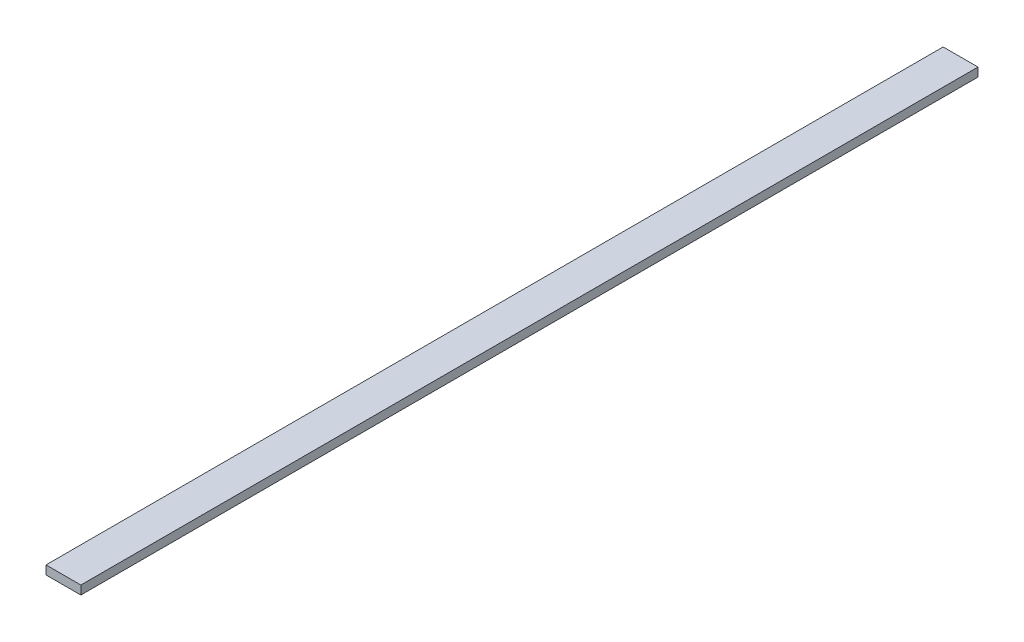
ISO-10303-21;
HEADER;
FILE_DESCRIPTION(('STEP AP214'),'2;1');
FILE_NAME('part.step','',(''),(''),'','','');
FILE_SCHEMA(('AUTOMOTIVE_DESIGN { 1 0 10303 214 1 1 1 1 }'));
ENDSEC;
DATA;
#1=APPLICATION_CONTEXT('core data for automotive mechanical design processes');
#2=APPLICATION_PROTOCOL_DEFINITION('international standard','automotive_design',2000,#1);
#3=PRODUCT_CONTEXT('',#1,'mechanical');
#4=PRODUCT('Part','Part','',(#3));
#5=PRODUCT_RELATED_PRODUCT_CATEGORY('part','',(#4));
#6=PRODUCT_DEFINITION_FORMATION('','',#4);
#7=PRODUCT_DEFINITION_CONTEXT('part definition',#1,'design');
#8=PRODUCT_DEFINITION('design','',#6,#7);
#9=PRODUCT_DEFINITION_SHAPE('','',#8);
#10=(LENGTH_UNIT() NAMED_UNIT(*) SI_UNIT(.MILLI.,.METRE.));
#11=(NAMED_UNIT(*) PLANE_ANGLE_UNIT() SI_UNIT($,.RADIAN.));
#12=(NAMED_UNIT(*) SI_UNIT($,.STERADIAN.) SOLID_ANGLE_UNIT());
#13=UNCERTAINTY_MEASURE_WITH_UNIT(LENGTH_MEASURE(1.E-05),#10,'distance_accuracy_value','');
#14=(GEOMETRIC_REPRESENTATION_CONTEXT(3) GLOBAL_UNCERTAINTY_ASSIGNED_CONTEXT((#13)) GLOBAL_UNIT_ASSIGNED_CONTEXT((#10,
#11,#12)) REPRESENTATION_CONTEXT('',''));
#15=CARTESIAN_POINT('',(0.,0.,0.));
#16=DIRECTION('',(0.,0.,1.));
#17=DIRECTION('',(1.,0.,0.));
#18=AXIS2_PLACEMENT_3D('',#15,#16,#17);
#19=CARTESIAN_POINT('',(0.,0.,-5150.));
#20=DIRECTION('',(1.,0.,0.));
#21=DIRECTION('',(0.,0.,-1.));
#22=AXIS2_PLACEMENT_3D('',#19,#20,#21);
#23=PLANE('',#22);
#24=DIRECTION('',(0.,1.,0.));
#25=VECTOR('',#24,1.);
#26=CARTESIAN_POINT('',(0.,0.,0.));
#27=LINE('',#26,#25);
#28=CARTESIAN_POINT('',(0.,0.,0.));
#29=VERTEX_POINT('',#28);
#30=CARTESIAN_POINT('',(0.,50.,0.));
#31=VERTEX_POINT('',#30);
#32=EDGE_CURVE('E100',#29,#31,#27,.T.);
#33=ORIENTED_EDGE('',*,*,#32,.F.);
#34=DIRECTION('',(0.,0.,1.));
#35=VECTOR('',#34,1.);
#36=CARTESIAN_POINT('',(0.,0.,-5150.));
#37=LINE('',#36,#35);
#38=CARTESIAN_POINT('',(0.,0.,-5150.));
#39=VERTEX_POINT('',#38);
#40=EDGE_CURVE('E11',#39,#29,#37,.T.);
#41=ORIENTED_EDGE('',*,*,#40,.F.);
#42=DIRECTION('',(0.,1.,0.));
#43=VECTOR('',#42,1.);
#44=CARTESIAN_POINT('',(0.,0.,-5150.));
#45=LINE('',#44,#43);
#46=CARTESIAN_POINT('',(0.,50.,-5150.));
#47=VERTEX_POINT('',#46);
#48=EDGE_CURVE('E94',#39,#47,#45,.T.);
#49=ORIENTED_EDGE('',*,*,#48,.T.);
#50=DIRECTION('',(0.,0.,1.));
#51=VECTOR('',#50,1.);
#52=CARTESIAN_POINT('',(0.,50.,-5150.));
#53=LINE('',#52,#51);
#54=EDGE_CURVE('E39',#47,#31,#53,.T.);
#55=ORIENTED_EDGE('',*,*,#54,.T.);
#56=EDGE_LOOP('',(#33,#41,#49,#55));
#57=FACE_BOUND('',#56,.T.);
#58=ADVANCED_FACE('F36',(#57),#23,.T.);
#59=CARTESIAN_POINT('',(0.,0.,-5150.));
#60=DIRECTION('',(0.,-1.,0.));
#61=DIRECTION('',(0.,0.,-1.));
#62=AXIS2_PLACEMENT_3D('',#59,#60,#61);
#63=PLANE('',#62);
#64=DIRECTION('',(1.,0.,0.));
#65=VECTOR('',#64,1.);
#66=CARTESIAN_POINT('',(0.,0.,0.));
#67=LINE('',#66,#65);
#68=CARTESIAN_POINT('',(-200.,0.,0.));
#69=VERTEX_POINT('',#68);
#70=EDGE_CURVE('E96',#69,#29,#67,.T.);
#71=ORIENTED_EDGE('',*,*,#70,.F.);
#72=DIRECTION('',(0.,0.,1.));
#73=VECTOR('',#72,1.);
#74=CARTESIAN_POINT('',(-200.,0.,-5150.));
#75=LINE('',#74,#73);
#76=CARTESIAN_POINT('',(-200.,0.,-5150.));
#77=VERTEX_POINT('',#76);
#78=EDGE_CURVE('E45',#77,#69,#75,.T.);
#79=ORIENTED_EDGE('',*,*,#78,.F.);
#80=DIRECTION('',(1.,0.,0.));
#81=VECTOR('',#80,1.);
#82=CARTESIAN_POINT('',(0.,0.,-5150.));
#83=LINE('',#82,#81);
#84=EDGE_CURVE('E91',#77,#39,#83,.T.);
#85=ORIENTED_EDGE('',*,*,#84,.T.);
#86=ORIENTED_EDGE('',*,*,#40,.T.);
#87=EDGE_LOOP('',(#71,#79,#85,#86));
#88=FACE_BOUND('',#87,.T.);
#89=ADVANCED_FACE('F110',(#88),#63,.T.);
#90=CARTESIAN_POINT('',(-200.,0.,-5150.));
#91=DIRECTION('',(-1.,0.,0.));
#92=DIRECTION('',(0.,0.,1.));
#93=AXIS2_PLACEMENT_3D('',#90,#91,#92);
#94=PLANE('',#93);
#95=DIRECTION('',(0.,-1.,0.));
#96=VECTOR('',#95,1.);
#97=CARTESIAN_POINT('',(-200.,0.,0.));
#98=LINE('',#97,#96);
#99=CARTESIAN_POINT('',(-200.,50.,0.));
#100=VERTEX_POINT('',#99);
#101=EDGE_CURVE('E86',#100,#69,#98,.T.);
#102=ORIENTED_EDGE('',*,*,#101,.F.);
#103=DIRECTION('',(0.,0.,1.));
#104=VECTOR('',#103,1.);
#105=CARTESIAN_POINT('',(-200.,50.,-5150.));
#106=LINE('',#105,#104);
#107=CARTESIAN_POINT('',(-200.,50.,-5150.));
#108=VERTEX_POINT('',#107);
#109=EDGE_CURVE('E81',#108,#100,#106,.T.);
#110=ORIENTED_EDGE('',*,*,#109,.F.);
#111=DIRECTION('',(0.,-1.,0.));
#112=VECTOR('',#111,1.);
#113=CARTESIAN_POINT('',(-200.,0.,-5150.));
#114=LINE('',#113,#112);
#115=EDGE_CURVE('E84',#108,#77,#114,.T.);
#116=ORIENTED_EDGE('',*,*,#115,.T.);
#117=ORIENTED_EDGE('',*,*,#78,.T.);
#118=EDGE_LOOP('',(#102,#110,#116,#117));
#119=FACE_BOUND('',#118,.T.);
#120=ADVANCED_FACE('F83',(#119),#94,.T.);
#121=CARTESIAN_POINT('',(0.,50.,-5150.));
#122=DIRECTION('',(0.,1.,0.));
#123=DIRECTION('',(-1.,0.,0.));
#124=AXIS2_PLACEMENT_3D('',#121,#122,#123);
#125=PLANE('',#124);
#126=DIRECTION('',(-1.,0.,0.));
#127=VECTOR('',#126,1.);
#128=CARTESIAN_POINT('',(0.,50.,0.));
#129=LINE('',#128,#127);
#130=EDGE_CURVE('E103',#31,#100,#129,.T.);
#131=ORIENTED_EDGE('',*,*,#130,.F.);
#132=ORIENTED_EDGE('',*,*,#54,.F.);
#133=DIRECTION('',(-1.,0.,0.));
#134=VECTOR('',#133,1.);
#135=CARTESIAN_POINT('',(0.,50.,-5150.));
#136=LINE('',#135,#134);
#137=EDGE_CURVE('E90',#47,#108,#136,.T.);
#138=ORIENTED_EDGE('',*,*,#137,.T.);
#139=ORIENTED_EDGE('',*,*,#109,.T.);
#140=EDGE_LOOP('',(#131,#132,#138,#139));
#141=FACE_BOUND('',#140,.T.);
#142=ADVANCED_FACE('F93',(#141),#125,.T.);
#143=CARTESIAN_POINT('',(0.,0.,-5150.));
#144=DIRECTION('',(0.,0.,1.));
#145=DIRECTION('',(1.,0.,0.));
#146=AXIS2_PLACEMENT_3D('',#143,#144,#145);
#147=PLANE('',#146);
#148=ORIENTED_EDGE('',*,*,#48,.F.);
#149=ORIENTED_EDGE('',*,*,#84,.F.);
#150=ORIENTED_EDGE('',*,*,#115,.F.);
#151=ORIENTED_EDGE('',*,*,#137,.F.);
#152=EDGE_LOOP('',(#148,#149,#150,#151));
#153=FACE_BOUND('',#152,.T.);
#154=ADVANCED_FACE('F89',(#153),#147,.F.);
#155=CARTESIAN_POINT('',(0.,0.,0.));
#156=DIRECTION('',(0.,0.,1.));
#157=DIRECTION('',(1.,0.,0.));
#158=AXIS2_PLACEMENT_3D('',#155,#156,#157);
#159=PLANE('',#158);
#160=ORIENTED_EDGE('',*,*,#32,.T.);
#161=ORIENTED_EDGE('',*,*,#130,.T.);
#162=ORIENTED_EDGE('',*,*,#101,.T.);
#163=ORIENTED_EDGE('',*,*,#70,.T.);
#164=EDGE_LOOP('',(#160,#161,#162,#163));
#165=FACE_BOUND('',#164,.T.);
#166=ADVANCED_FACE('F109',(#165),#159,.T.);
#167=CLOSED_SHELL('',(#58,#89,#120,#142,#154,#166));
#168=MANIFOLD_SOLID_BREP('B2',#167);
#169=ADVANCED_BREP_SHAPE_REPRESENTATION('',(#18,#168),#14);
#170=SHAPE_DEFINITION_REPRESENTATION(#9,#169);
ENDSEC;
END-ISO-10303-21;
